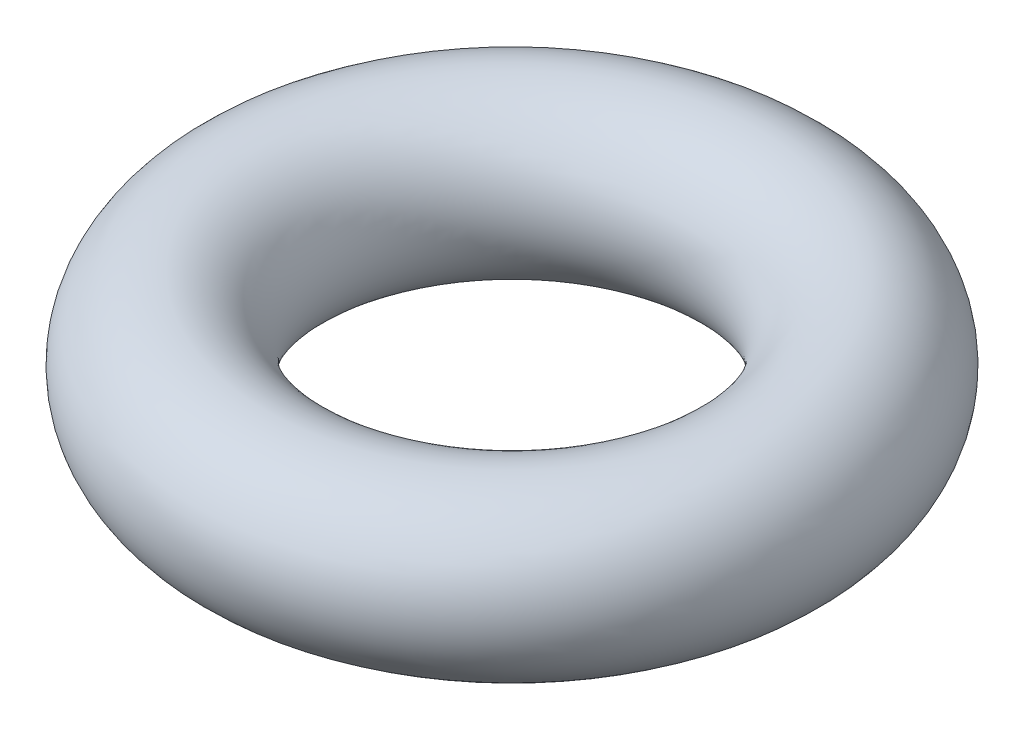
ISO-10303-21;
HEADER;
FILE_DESCRIPTION(('STEP AP214'),'2;1');
FILE_NAME('part.step','',(''),(''),'','','');
FILE_SCHEMA(('AUTOMOTIVE_DESIGN { 1 0 10303 214 1 1 1 1 }'));
ENDSEC;
DATA;
#1=APPLICATION_CONTEXT('core data for automotive mechanical design processes');
#2=APPLICATION_PROTOCOL_DEFINITION('international standard','automotive_design',2000,#1);
#3=PRODUCT_CONTEXT('',#1,'mechanical');
#4=PRODUCT('Part','Part','',(#3));
#5=PRODUCT_RELATED_PRODUCT_CATEGORY('part','',(#4));
#6=PRODUCT_DEFINITION_FORMATION('','',#4);
#7=PRODUCT_DEFINITION_CONTEXT('part definition',#1,'design');
#8=PRODUCT_DEFINITION('design','',#6,#7);
#9=PRODUCT_DEFINITION_SHAPE('','',#8);
#10=(LENGTH_UNIT() NAMED_UNIT(*) SI_UNIT(.MILLI.,.METRE.));
#11=(NAMED_UNIT(*) PLANE_ANGLE_UNIT() SI_UNIT($,.RADIAN.));
#12=(NAMED_UNIT(*) SI_UNIT($,.STERADIAN.) SOLID_ANGLE_UNIT());
#13=UNCERTAINTY_MEASURE_WITH_UNIT(LENGTH_MEASURE(1.E-05),#10,'distance_accuracy_value','');
#14=(GEOMETRIC_REPRESENTATION_CONTEXT(3) GLOBAL_UNCERTAINTY_ASSIGNED_CONTEXT((#13)) GLOBAL_UNIT_ASSIGNED_CONTEXT((#10,
#11,#12)) REPRESENTATION_CONTEXT('',''));
#15=CARTESIAN_POINT('',(0.,0.,0.));
#16=DIRECTION('',(0.,0.,1.));
#17=DIRECTION('',(1.,0.,0.));
#18=AXIS2_PLACEMENT_3D('',#15,#16,#17);
#19=CARTESIAN_POINT('',(0.,0.,0.));
#20=DIRECTION('',(0.,-1.,0.));
#21=DIRECTION('',(0.,0.,-1.));
#22=AXIS2_PLACEMENT_3D('',#19,#20,#21);
#23=TOROIDAL_SURFACE('',#22,2.3876,0.79375);
#24=CARTESIAN_POINT('',(0.,0.,-3.18135));
#25=VERTEX_POINT('',#24);
#26=VERTEX_LOOP('',#25);
#27=FACE_BOUND('',#26,.T.);
#28=ADVANCED_FACE('F41',(#27),#23,.T.);
#29=CLOSED_SHELL('',(#28));
#30=MANIFOLD_SOLID_BREP('B2',#29);
#31=ADVANCED_BREP_SHAPE_REPRESENTATION('',(#18,#30),#14);
#32=SHAPE_DEFINITION_REPRESENTATION(#9,#31);
ENDSEC;
END-ISO-10303-21;
